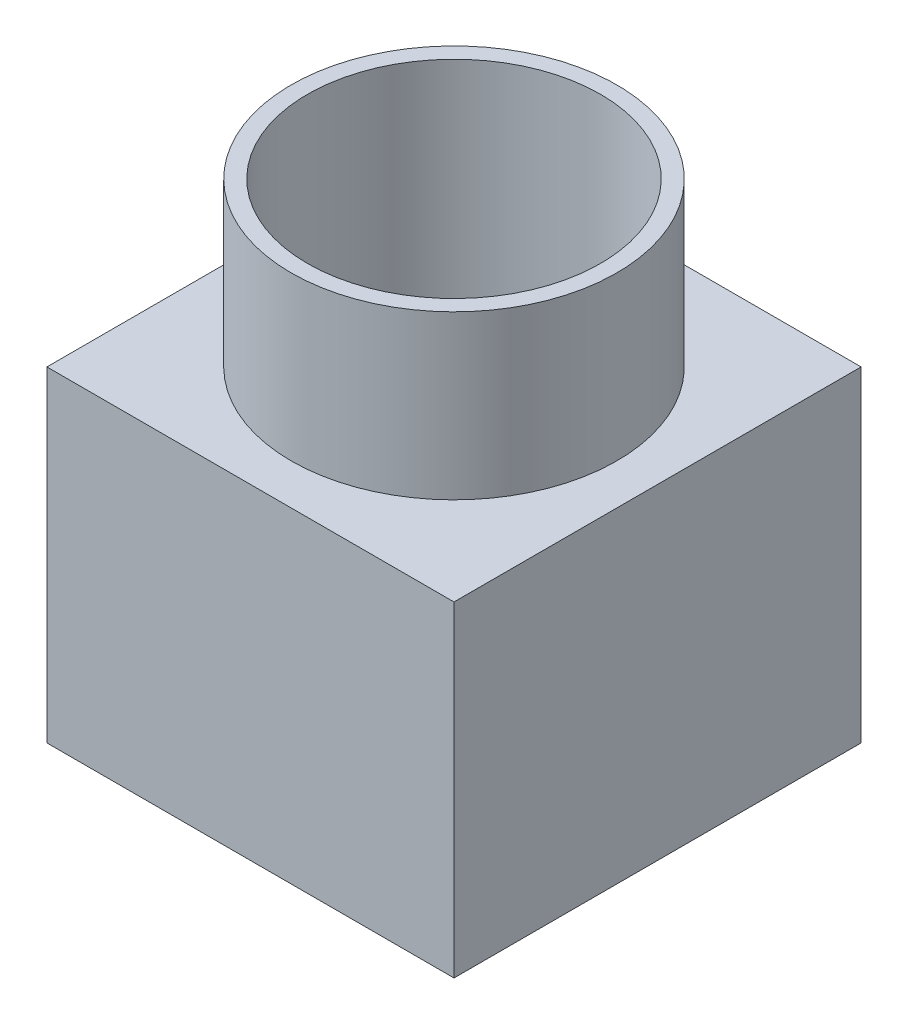
ISO-10303-21;
HEADER;
FILE_DESCRIPTION(('STEP AP214'),'2;1');
FILE_NAME('part.step','',(''),(''),'','','');
FILE_SCHEMA(('AUTOMOTIVE_DESIGN { 1 0 10303 214 1 1 1 1 }'));
ENDSEC;
DATA;
#1=APPLICATION_CONTEXT('core data for automotive mechanical design processes');
#2=APPLICATION_PROTOCOL_DEFINITION('international standard','automotive_design',2000,#1);
#3=PRODUCT_CONTEXT('',#1,'mechanical');
#4=PRODUCT('Part','Part','',(#3));
#5=PRODUCT_RELATED_PRODUCT_CATEGORY('part','',(#4));
#6=PRODUCT_DEFINITION_FORMATION('','',#4);
#7=PRODUCT_DEFINITION_CONTEXT('part definition',#1,'design');
#8=PRODUCT_DEFINITION('design','',#6,#7);
#9=PRODUCT_DEFINITION_SHAPE('','',#8);
#10=(LENGTH_UNIT() NAMED_UNIT(*) SI_UNIT(.MILLI.,.METRE.));
#11=(NAMED_UNIT(*) PLANE_ANGLE_UNIT() SI_UNIT($,.RADIAN.));
#12=(NAMED_UNIT(*) SI_UNIT($,.STERADIAN.) SOLID_ANGLE_UNIT());
#13=UNCERTAINTY_MEASURE_WITH_UNIT(LENGTH_MEASURE(1.E-05),#10,'distance_accuracy_value','');
#14=(GEOMETRIC_REPRESENTATION_CONTEXT(3) GLOBAL_UNCERTAINTY_ASSIGNED_CONTEXT((#13)) GLOBAL_UNIT_ASSIGNED_CONTEXT((#10,
#11,#12)) REPRESENTATION_CONTEXT('',''));
#15=CARTESIAN_POINT('',(0.,0.,0.));
#16=DIRECTION('',(0.,0.,1.));
#17=DIRECTION('',(1.,0.,0.));
#18=AXIS2_PLACEMENT_3D('',#15,#16,#17);
#19=CARTESIAN_POINT('',(0.,0.,0.));
#20=DIRECTION('',(0.,-1.,0.));
#21=DIRECTION('',(0.,0.,-1.));
#22=AXIS2_PLACEMENT_3D('',#19,#20,#21);
#23=PLANE('',#22);
#24=DIRECTION('',(0.,0.,-1.));
#25=VECTOR('',#24,1.);
#26=CARTESIAN_POINT('',(12.5,0.,12.5));
#27=LINE('',#26,#25);
#28=CARTESIAN_POINT('',(12.5,0.,12.5));
#29=VERTEX_POINT('',#28);
#30=CARTESIAN_POINT('',(12.5,0.,-12.5));
#31=VERTEX_POINT('',#30);
#32=EDGE_CURVE('E162',#29,#31,#27,.T.);
#33=ORIENTED_EDGE('',*,*,#32,.F.);
#34=DIRECTION('',(1.,0.,0.));
#35=VECTOR('',#34,1.);
#36=CARTESIAN_POINT('',(-12.5,0.,12.5));
#37=LINE('',#36,#35);
#38=CARTESIAN_POINT('',(-12.5,0.,12.5));
#39=VERTEX_POINT('',#38);
#40=EDGE_CURVE('E79',#39,#29,#37,.T.);
#41=ORIENTED_EDGE('',*,*,#40,.F.);
#42=DIRECTION('',(0.,0.,1.));
#43=VECTOR('',#42,1.);
#44=CARTESIAN_POINT('',(-12.5,0.,12.5));
#45=LINE('',#44,#43);
#46=CARTESIAN_POINT('',(-12.5,0.,-12.5));
#47=VERTEX_POINT('',#46);
#48=EDGE_CURVE('E175',#47,#39,#45,.T.);
#49=ORIENTED_EDGE('',*,*,#48,.F.);
#50=DIRECTION('',(-1.,0.,0.));
#51=VECTOR('',#50,1.);
#52=CARTESIAN_POINT('',(-12.5,0.,-12.5));
#53=LINE('',#52,#51);
#54=EDGE_CURVE('E173',#31,#47,#53,.T.);
#55=ORIENTED_EDGE('',*,*,#54,.F.);
#56=EDGE_LOOP('',(#33,#41,#49,#55));
#57=FACE_BOUND('',#56,.T.);
#58=DIRECTION('',(1.,0.,0.));
#59=VECTOR('',#58,1.);
#60=CARTESIAN_POINT('',(0.,0.,10.5));
#61=LINE('',#60,#59);
#62=CARTESIAN_POINT('',(-11.5,0.,10.5));
#63=VERTEX_POINT('',#62);
#64=CARTESIAN_POINT('',(11.5,0.,10.5));
#65=VERTEX_POINT('',#64);
#66=EDGE_CURVE('E127',#63,#65,#61,.T.);
#67=ORIENTED_EDGE('',*,*,#66,.T.);
#68=DIRECTION('',(0.,0.,-1.));
#69=VECTOR('',#68,1.);
#70=CARTESIAN_POINT('',(11.5,0.,0.));
#71=LINE('',#70,#69);
#72=CARTESIAN_POINT('',(11.5,0.,-10.5));
#73=VERTEX_POINT('',#72);
#74=EDGE_CURVE('E149',#65,#73,#71,.T.);
#75=ORIENTED_EDGE('',*,*,#74,.T.);
#76=DIRECTION('',(-1.,0.,0.));
#77=VECTOR('',#76,1.);
#78=CARTESIAN_POINT('',(0.,0.,-10.5));
#79=LINE('',#78,#77);
#80=CARTESIAN_POINT('',(-11.5,0.,-10.5));
#81=VERTEX_POINT('',#80);
#82=EDGE_CURVE('E131',#73,#81,#79,.T.);
#83=ORIENTED_EDGE('',*,*,#82,.T.);
#84=DIRECTION('',(0.,0.,1.));
#85=VECTOR('',#84,1.);
#86=CARTESIAN_POINT('',(-11.5,0.,0.));
#87=LINE('',#86,#85);
#88=EDGE_CURVE('E49',#81,#63,#87,.T.);
#89=ORIENTED_EDGE('',*,*,#88,.T.);
#90=EDGE_LOOP('',(#67,#75,#83,#89));
#91=FACE_BOUND('',#90,.T.);
#92=ADVANCED_FACE('F33',(#57,#91),#23,.T.);
#93=CARTESIAN_POINT('',(12.5,20.,12.5));
#94=DIRECTION('',(-1.,0.,0.));
#95=DIRECTION('',(0.,0.,1.));
#96=AXIS2_PLACEMENT_3D('',#93,#94,#95);
#97=PLANE('',#96);
#98=ORIENTED_EDGE('',*,*,#32,.T.);
#99=DIRECTION('',(0.,-1.,0.));
#100=VECTOR('',#99,1.);
#101=CARTESIAN_POINT('',(12.5,20.,-12.5));
#102=LINE('',#101,#100);
#103=CARTESIAN_POINT('',(12.5,20.,-12.5));
#104=VERTEX_POINT('',#103);
#105=EDGE_CURVE('E37',#104,#31,#102,.T.);
#106=ORIENTED_EDGE('',*,*,#105,.F.);
#107=DIRECTION('',(0.,0.,-1.));
#108=VECTOR('',#107,1.);
#109=CARTESIAN_POINT('',(12.5,20.,12.5));
#110=LINE('',#109,#108);
#111=CARTESIAN_POINT('',(12.5,20.,12.5));
#112=VERTEX_POINT('',#111);
#113=EDGE_CURVE('E164',#112,#104,#110,.T.);
#114=ORIENTED_EDGE('',*,*,#113,.F.);
#115=DIRECTION('',(0.,-1.,0.));
#116=VECTOR('',#115,1.);
#117=CARTESIAN_POINT('',(12.5,20.,12.5));
#118=LINE('',#117,#116);
#119=EDGE_CURVE('E170',#112,#29,#118,.T.);
#120=ORIENTED_EDGE('',*,*,#119,.T.);
#121=EDGE_LOOP('',(#98,#106,#114,#120));
#122=FACE_BOUND('',#121,.T.);
#123=ADVANCED_FACE('F35',(#122),#97,.F.);
#124=CARTESIAN_POINT('',(-12.5,20.,-12.5));
#125=DIRECTION('',(0.,0.,1.));
#126=DIRECTION('',(1.,0.,0.));
#127=AXIS2_PLACEMENT_3D('',#124,#125,#126);
#128=PLANE('',#127);
#129=ORIENTED_EDGE('',*,*,#54,.T.);
#130=DIRECTION('',(0.,-1.,0.));
#131=VECTOR('',#130,1.);
#132=CARTESIAN_POINT('',(-12.5,20.,-12.5));
#133=LINE('',#132,#131);
#134=CARTESIAN_POINT('',(-12.5,20.,-12.5));
#135=VERTEX_POINT('',#134);
#136=EDGE_CURVE('E180',#135,#47,#133,.T.);
#137=ORIENTED_EDGE('',*,*,#136,.F.);
#138=DIRECTION('',(-1.,0.,0.));
#139=VECTOR('',#138,1.);
#140=CARTESIAN_POINT('',(-12.5,20.,-12.5));
#141=LINE('',#140,#139);
#142=EDGE_CURVE('E87',#104,#135,#141,.T.);
#143=ORIENTED_EDGE('',*,*,#142,.F.);
#144=ORIENTED_EDGE('',*,*,#105,.T.);
#145=EDGE_LOOP('',(#129,#137,#143,#144));
#146=FACE_BOUND('',#145,.T.);
#147=ADVANCED_FACE('F186',(#146),#128,.F.);
#148=CARTESIAN_POINT('',(-12.5,20.,12.5));
#149=DIRECTION('',(1.,0.,0.));
#150=DIRECTION('',(0.,0.,-1.));
#151=AXIS2_PLACEMENT_3D('',#148,#149,#150);
#152=PLANE('',#151);
#153=ORIENTED_EDGE('',*,*,#48,.T.);
#154=DIRECTION('',(0.,-1.,0.));
#155=VECTOR('',#154,1.);
#156=CARTESIAN_POINT('',(-12.5,20.,12.5));
#157=LINE('',#156,#155);
#158=CARTESIAN_POINT('',(-12.5,20.,12.5));
#159=VERTEX_POINT('',#158);
#160=EDGE_CURVE('E179',#159,#39,#157,.T.);
#161=ORIENTED_EDGE('',*,*,#160,.F.);
#162=DIRECTION('',(0.,0.,1.));
#163=VECTOR('',#162,1.);
#164=CARTESIAN_POINT('',(-12.5,20.,12.5));
#165=LINE('',#164,#163);
#166=EDGE_CURVE('E167',#135,#159,#165,.T.);
#167=ORIENTED_EDGE('',*,*,#166,.F.);
#168=ORIENTED_EDGE('',*,*,#136,.T.);
#169=EDGE_LOOP('',(#153,#161,#167,#168));
#170=FACE_BOUND('',#169,.T.);
#171=ADVANCED_FACE('F193',(#170),#152,.F.);
#172=CARTESIAN_POINT('',(-12.5,20.,12.5));
#173=DIRECTION('',(0.,0.,-1.));
#174=DIRECTION('',(-1.,0.,0.));
#175=AXIS2_PLACEMENT_3D('',#172,#173,#174);
#176=PLANE('',#175);
#177=ORIENTED_EDGE('',*,*,#40,.T.);
#178=ORIENTED_EDGE('',*,*,#119,.F.);
#179=DIRECTION('',(1.,0.,0.));
#180=VECTOR('',#179,1.);
#181=CARTESIAN_POINT('',(-12.5,20.,12.5));
#182=LINE('',#181,#180);
#183=EDGE_CURVE('E58',#159,#112,#182,.T.);
#184=ORIENTED_EDGE('',*,*,#183,.F.);
#185=ORIENTED_EDGE('',*,*,#160,.T.);
#186=EDGE_LOOP('',(#177,#178,#184,#185));
#187=FACE_BOUND('',#186,.T.);
#188=ADVANCED_FACE('F194',(#187),#176,.F.);
#189=CARTESIAN_POINT('',(0.,20.,0.));
#190=DIRECTION('',(0.,-1.,0.));
#191=DIRECTION('',(0.,0.,-1.));
#192=AXIS2_PLACEMENT_3D('',#189,#190,#191);
#193=PLANE('',#192);
#194=CARTESIAN_POINT('',(0.,20.,0.));
#195=DIRECTION('',(0.,1.,0.));
#196=DIRECTION('',(0.,0.,1.));
#197=AXIS2_PLACEMENT_3D('',#194,#195,#196);
#198=CIRCLE('',#197,10.);
#199=CARTESIAN_POINT('',(0.,20.,10.));
#200=VERTEX_POINT('',#199);
#201=EDGE_CURVE('E11',#200,#200,#198,.T.);
#202=ORIENTED_EDGE('',*,*,#201,.F.);
#203=EDGE_LOOP('',(#202));
#204=FACE_BOUND('',#203,.T.);
#205=ORIENTED_EDGE('',*,*,#113,.T.);
#206=ORIENTED_EDGE('',*,*,#142,.T.);
#207=ORIENTED_EDGE('',*,*,#166,.T.);
#208=ORIENTED_EDGE('',*,*,#183,.T.);
#209=EDGE_LOOP('',(#205,#206,#207,#208));
#210=FACE_BOUND('',#209,.T.);
#211=ADVANCED_FACE('F195',(#204,#210),#193,.F.);
#212=CARTESIAN_POINT('',(0.,30.,0.));
#213=DIRECTION('',(0.,-1.,0.));
#214=DIRECTION('',(0.,0.,-1.));
#215=AXIS2_PLACEMENT_3D('',#212,#213,#214);
#216=CYLINDRICAL_SURFACE('',#215,10.);
#217=CARTESIAN_POINT('',(0.,30.,0.));
#218=DIRECTION('',(0.,1.,0.));
#219=DIRECTION('',(0.,0.,1.));
#220=AXIS2_PLACEMENT_3D('',#217,#218,#219);
#221=CIRCLE('',#220,10.);
#222=CARTESIAN_POINT('',(0.,30.,10.));
#223=VERTEX_POINT('',#222);
#224=EDGE_CURVE('E158',#223,#223,#221,.T.);
#225=ORIENTED_EDGE('',*,*,#224,.F.);
#226=EDGE_LOOP('',(#225));
#227=FACE_BOUND('',#226,.T.);
#228=ORIENTED_EDGE('',*,*,#201,.T.);
#229=EDGE_LOOP('',(#228));
#230=FACE_BOUND('',#229,.T.);
#231=ADVANCED_FACE('F197',(#227,#230),#216,.T.);
#232=CARTESIAN_POINT('',(0.,30.,0.));
#233=DIRECTION('',(0.,1.,0.));
#234=DIRECTION('',(0.,0.,1.));
#235=AXIS2_PLACEMENT_3D('',#232,#233,#234);
#236=PLANE('',#235);
#237=CARTESIAN_POINT('',(0.,30.,0.));
#238=DIRECTION('',(0.,1.,0.));
#239=DIRECTION('',(0.,0.,1.));
#240=AXIS2_PLACEMENT_3D('',#237,#238,#239);
#241=CIRCLE('',#240,9.);
#242=CARTESIAN_POINT('',(0.,30.,9.));
#243=VERTEX_POINT('',#242);
#244=EDGE_CURVE('E136',#243,#243,#241,.T.);
#245=ORIENTED_EDGE('',*,*,#244,.F.);
#246=EDGE_LOOP('',(#245));
#247=FACE_BOUND('',#246,.T.);
#248=ORIENTED_EDGE('',*,*,#224,.T.);
#249=EDGE_LOOP('',(#248));
#250=FACE_BOUND('',#249,.T.);
#251=ADVANCED_FACE('F204',(#247,#250),#236,.T.);
#252=CARTESIAN_POINT('',(0.,10.,0.));
#253=DIRECTION('',(0.,1.,0.));
#254=DIRECTION('',(0.,0.,1.));
#255=AXIS2_PLACEMENT_3D('',#252,#253,#254);
#256=CYLINDRICAL_SURFACE('',#255,9.);
#257=CARTESIAN_POINT('',(0.,10.,0.));
#258=DIRECTION('',(0.,1.,0.));
#259=DIRECTION('',(0.,0.,1.));
#260=AXIS2_PLACEMENT_3D('',#257,#258,#259);
#261=CIRCLE('',#260,9.);
#262=CARTESIAN_POINT('',(0.,10.,9.));
#263=VERTEX_POINT('',#262);
#264=EDGE_CURVE('E155',#263,#263,#261,.T.);
#265=ORIENTED_EDGE('',*,*,#264,.F.);
#266=EDGE_LOOP('',(#265));
#267=FACE_BOUND('',#266,.T.);
#268=ORIENTED_EDGE('',*,*,#244,.T.);
#269=EDGE_LOOP('',(#268));
#270=FACE_BOUND('',#269,.T.);
#271=ADVANCED_FACE('F248',(#267,#270),#256,.F.);
#272=CARTESIAN_POINT('',(0.,10.,0.));
#273=DIRECTION('',(0.,1.,0.));
#274=DIRECTION('',(0.,0.,1.));
#275=AXIS2_PLACEMENT_3D('',#272,#273,#274);
#276=PLANE('',#275);
#277=ORIENTED_EDGE('',*,*,#264,.T.);
#278=EDGE_LOOP('',(#277));
#279=FACE_BOUND('',#278,.T.);
#280=ADVANCED_FACE('F258',(#279),#276,.T.);
#281=CARTESIAN_POINT('',(0.,10.,0.));
#282=DIRECTION('',(0.,1.,0.));
#283=DIRECTION('',(0.,0.,1.));
#284=AXIS2_PLACEMENT_3D('',#281,#282,#283);
#285=CYLINDRICAL_SURFACE('',#284,10.);
#286=CARTESIAN_POINT('',(0.,9.,0.));
#287=DIRECTION('',(0.,1.,0.));
#288=DIRECTION('',(0.,0.,1.));
#289=AXIS2_PLACEMENT_3D('',#286,#287,#288);
#290=CIRCLE('',#289,10.);
#291=CARTESIAN_POINT('',(0.,9.,10.));
#292=VERTEX_POINT('',#291);
#293=EDGE_CURVE('E146',#292,#292,#290,.T.);
#294=ORIENTED_EDGE('',*,*,#293,.T.);
#295=EDGE_LOOP('',(#294));
#296=FACE_BOUND('',#295,.T.);
#297=CARTESIAN_POINT('',(0.,19.,0.));
#298=DIRECTION('',(0.,-1.,0.));
#299=DIRECTION('',(0.,0.,-1.));
#300=AXIS2_PLACEMENT_3D('',#297,#298,#299);
#301=CIRCLE('',#300,10.);
#302=CARTESIAN_POINT('',(0.,19.,-10.));
#303=VERTEX_POINT('',#302);
#304=EDGE_CURVE('E132',#303,#303,#301,.F.);
#305=ORIENTED_EDGE('',*,*,#304,.F.);
#306=EDGE_LOOP('',(#305));
#307=FACE_BOUND('',#306,.T.);
#308=ADVANCED_FACE('F267',(#296,#307),#285,.T.);
#309=CARTESIAN_POINT('',(11.5,20.,12.5));
#310=DIRECTION('',(-1.,0.,0.));
#311=DIRECTION('',(0.,0.,1.));
#312=AXIS2_PLACEMENT_3D('',#309,#310,#311);
#313=PLANE('',#312);
#314=ORIENTED_EDGE('',*,*,#74,.F.);
#315=DIRECTION('',(0.,-1.,0.));
#316=VECTOR('',#315,1.);
#317=CARTESIAN_POINT('',(11.5,20.,10.5));
#318=LINE('',#317,#316);
#319=CARTESIAN_POINT('',(11.5,19.,10.5));
#320=VERTEX_POINT('',#319);
#321=EDGE_CURVE('E126',#320,#65,#318,.T.);
#322=ORIENTED_EDGE('',*,*,#321,.F.);
#323=DIRECTION('',(0.,0.,-1.));
#324=VECTOR('',#323,1.);
#325=CARTESIAN_POINT('',(11.5,19.,0.));
#326=LINE('',#325,#324);
#327=CARTESIAN_POINT('',(11.5,19.,-10.5));
#328=VERTEX_POINT('',#327);
#329=EDGE_CURVE('E114',#320,#328,#326,.T.);
#330=ORIENTED_EDGE('',*,*,#329,.T.);
#331=DIRECTION('',(0.,-1.,0.));
#332=VECTOR('',#331,1.);
#333=CARTESIAN_POINT('',(11.5,20.,-10.5));
#334=LINE('',#333,#332);
#335=EDGE_CURVE('E124',#328,#73,#334,.T.);
#336=ORIENTED_EDGE('',*,*,#335,.T.);
#337=EDGE_LOOP('',(#314,#322,#330,#336));
#338=FACE_BOUND('',#337,.T.);
#339=ADVANCED_FACE('F123',(#338),#313,.T.);
#340=CARTESIAN_POINT('',(-12.5,20.,-10.5));
#341=DIRECTION('',(0.,0.,1.));
#342=DIRECTION('',(1.,0.,0.));
#343=AXIS2_PLACEMENT_3D('',#340,#341,#342);
#344=PLANE('',#343);
#345=ORIENTED_EDGE('',*,*,#82,.F.);
#346=ORIENTED_EDGE('',*,*,#335,.F.);
#347=DIRECTION('',(-1.,0.,0.));
#348=VECTOR('',#347,1.);
#349=CARTESIAN_POINT('',(0.,19.,-10.5));
#350=LINE('',#349,#348);
#351=CARTESIAN_POINT('',(-11.5,19.,-10.5));
#352=VERTEX_POINT('',#351);
#353=EDGE_CURVE('E110',#328,#352,#350,.T.);
#354=ORIENTED_EDGE('',*,*,#353,.T.);
#355=DIRECTION('',(0.,-1.,0.));
#356=VECTOR('',#355,1.);
#357=CARTESIAN_POINT('',(-11.5,20.,-10.5));
#358=LINE('',#357,#356);
#359=EDGE_CURVE('E133',#352,#81,#358,.T.);
#360=ORIENTED_EDGE('',*,*,#359,.T.);
#361=EDGE_LOOP('',(#345,#346,#354,#360));
#362=FACE_BOUND('',#361,.T.);
#363=ADVANCED_FACE('F129',(#362),#344,.T.);
#364=CARTESIAN_POINT('',(-11.5,20.,12.5));
#365=DIRECTION('',(1.,0.,0.));
#366=DIRECTION('',(0.,0.,-1.));
#367=AXIS2_PLACEMENT_3D('',#364,#365,#366);
#368=PLANE('',#367);
#369=ORIENTED_EDGE('',*,*,#88,.F.);
#370=ORIENTED_EDGE('',*,*,#359,.F.);
#371=DIRECTION('',(0.,0.,1.));
#372=VECTOR('',#371,1.);
#373=CARTESIAN_POINT('',(-11.5,19.,0.));
#374=LINE('',#373,#372);
#375=CARTESIAN_POINT('',(-11.5,19.,10.5));
#376=VERTEX_POINT('',#375);
#377=EDGE_CURVE('E115',#352,#376,#374,.T.);
#378=ORIENTED_EDGE('',*,*,#377,.T.);
#379=DIRECTION('',(0.,-1.,0.));
#380=VECTOR('',#379,1.);
#381=CARTESIAN_POINT('',(-11.5,20.,10.5));
#382=LINE('',#381,#380);
#383=EDGE_CURVE('E138',#376,#63,#382,.T.);
#384=ORIENTED_EDGE('',*,*,#383,.T.);
#385=EDGE_LOOP('',(#369,#370,#378,#384));
#386=FACE_BOUND('',#385,.T.);
#387=ADVANCED_FACE('F301',(#386),#368,.T.);
#388=CARTESIAN_POINT('',(-12.5,20.,10.5));
#389=DIRECTION('',(0.,0.,-1.));
#390=DIRECTION('',(-1.,0.,0.));
#391=AXIS2_PLACEMENT_3D('',#388,#389,#390);
#392=PLANE('',#391);
#393=ORIENTED_EDGE('',*,*,#66,.F.);
#394=ORIENTED_EDGE('',*,*,#383,.F.);
#395=DIRECTION('',(1.,0.,0.));
#396=VECTOR('',#395,1.);
#397=CARTESIAN_POINT('',(0.,19.,10.5));
#398=LINE('',#397,#396);
#399=EDGE_CURVE('E141',#376,#320,#398,.T.);
#400=ORIENTED_EDGE('',*,*,#399,.T.);
#401=ORIENTED_EDGE('',*,*,#321,.T.);
#402=EDGE_LOOP('',(#393,#394,#400,#401));
#403=FACE_BOUND('',#402,.T.);
#404=ADVANCED_FACE('F310',(#403),#392,.T.);
#405=CARTESIAN_POINT('',(0.,19.,0.));
#406=DIRECTION('',(0.,-1.,0.));
#407=DIRECTION('',(0.,0.,-1.));
#408=AXIS2_PLACEMENT_3D('',#405,#406,#407);
#409=PLANE('',#408);
#410=ORIENTED_EDGE('',*,*,#304,.T.);
#411=EDGE_LOOP('',(#410));
#412=FACE_BOUND('',#411,.T.);
#413=ORIENTED_EDGE('',*,*,#329,.F.);
#414=ORIENTED_EDGE('',*,*,#399,.F.);
#415=ORIENTED_EDGE('',*,*,#377,.F.);
#416=ORIENTED_EDGE('',*,*,#353,.F.);
#417=EDGE_LOOP('',(#413,#414,#415,#416));
#418=FACE_BOUND('',#417,.T.);
#419=ADVANCED_FACE('F112',(#412,#418),#409,.T.);
#420=CARTESIAN_POINT('',(0.,9.,0.));
#421=DIRECTION('',(0.,1.,0.));
#422=DIRECTION('',(0.,0.,1.));
#423=AXIS2_PLACEMENT_3D('',#420,#421,#422);
#424=PLANE('',#423);
#425=ORIENTED_EDGE('',*,*,#293,.F.);
#426=EDGE_LOOP('',(#425));
#427=FACE_BOUND('',#426,.T.);
#428=ADVANCED_FACE('F327',(#427),#424,.F.);
#429=CLOSED_SHELL('',(#92,#123,#147,#171,#188,#211,#231,#251,#271,#280,#308,#339,#363,#387,#404,
#419,#428));
#430=MANIFOLD_SOLID_BREP('B2',#429);
#431=ADVANCED_BREP_SHAPE_REPRESENTATION('',(#18,#430),#14);
#432=SHAPE_DEFINITION_REPRESENTATION(#9,#431);
ENDSEC;
END-ISO-10303-21;
